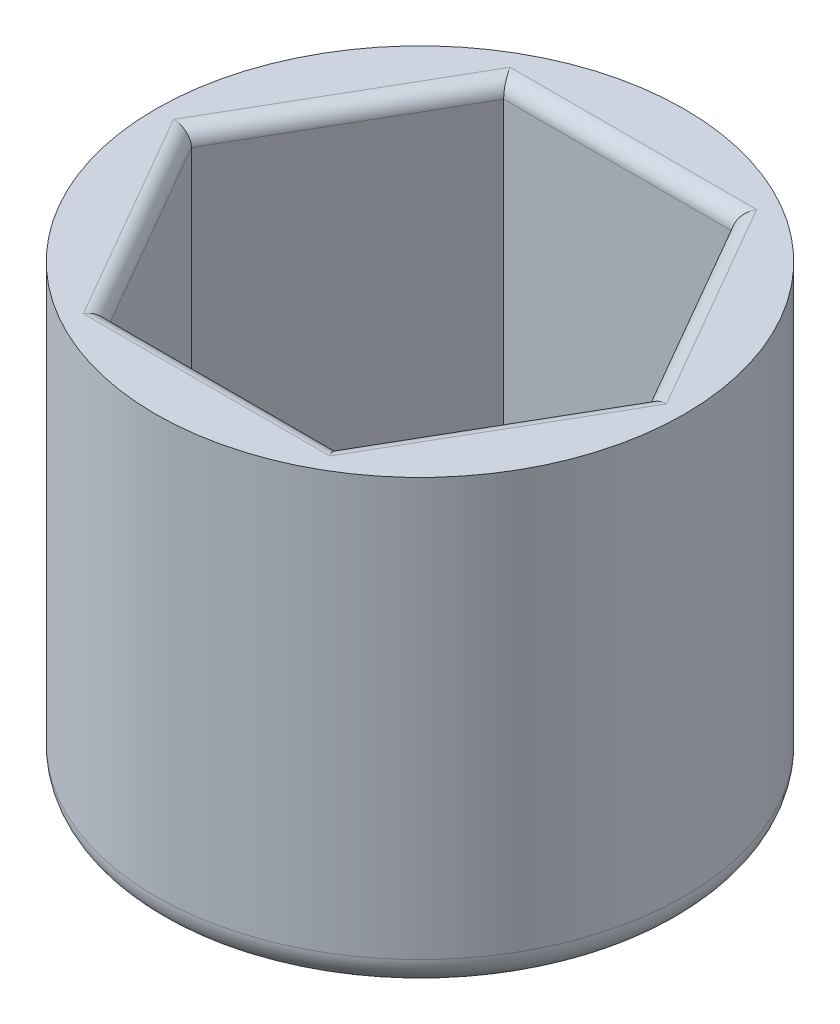
ISO-10303-21;
HEADER;
FILE_DESCRIPTION(('STEP AP214'),'2;1');
FILE_NAME('part.step','',(''),(''),'','','');
FILE_SCHEMA(('AUTOMOTIVE_DESIGN { 1 0 10303 214 1 1 1 1 }'));
ENDSEC;
DATA;
#1=APPLICATION_CONTEXT('core data for automotive mechanical design processes');
#2=APPLICATION_PROTOCOL_DEFINITION('international standard','automotive_design',2000,#1);
#3=PRODUCT_CONTEXT('',#1,'mechanical');
#4=PRODUCT('Part','Part','',(#3));
#5=PRODUCT_RELATED_PRODUCT_CATEGORY('part','',(#4));
#6=PRODUCT_DEFINITION_FORMATION('','',#4);
#7=PRODUCT_DEFINITION_CONTEXT('part definition',#1,'design');
#8=PRODUCT_DEFINITION('design','',#6,#7);
#9=PRODUCT_DEFINITION_SHAPE('','',#8);
#10=(LENGTH_UNIT() NAMED_UNIT(*) SI_UNIT(.MILLI.,.METRE.));
#11=(NAMED_UNIT(*) PLANE_ANGLE_UNIT() SI_UNIT($,.RADIAN.));
#12=(NAMED_UNIT(*) SI_UNIT($,.STERADIAN.) SOLID_ANGLE_UNIT());
#13=UNCERTAINTY_MEASURE_WITH_UNIT(LENGTH_MEASURE(1.E-05),#10,'distance_accuracy_value','');
#14=(GEOMETRIC_REPRESENTATION_CONTEXT(3) GLOBAL_UNCERTAINTY_ASSIGNED_CONTEXT((#13)) GLOBAL_UNIT_ASSIGNED_CONTEXT((#10,
#11,#12)) REPRESENTATION_CONTEXT('',''));
#15=CARTESIAN_POINT('',(0.,0.,0.));
#16=DIRECTION('',(0.,0.,1.));
#17=DIRECTION('',(1.,0.,0.));
#18=AXIS2_PLACEMENT_3D('',#15,#16,#17);
#19=CARTESIAN_POINT('',(0.,12.,0.));
#20=DIRECTION('',(0.,1.,0.));
#21=DIRECTION('',(0.,0.,1.));
#22=AXIS2_PLACEMENT_3D('',#19,#20,#21);
#23=PLANE('',#22);
#24=DIRECTION('',(0.5,0.,-0.866025403784439));
#25=VECTOR('',#24,1.);
#26=CARTESIAN_POINT('',(5.97557528611263,12.,3.45));
#27=LINE('',#26,#25);
#28=CARTESIAN_POINT('',(7.96743371481684,12.,0.));
#29=VERTEX_POINT('',#28);
#30=CARTESIAN_POINT('',(3.98371685740842,12.,6.9));
#31=VERTEX_POINT('',#30);
#32=EDGE_CURVE('E160',#29,#31,#27,.F.);
#33=ORIENTED_EDGE('',*,*,#32,.T.);
#34=DIRECTION('',(1.,0.,0.));
#35=VECTOR('',#34,1.);
#36=CARTESIAN_POINT('',(0.,12.,6.9));
#37=LINE('',#36,#35);
#38=CARTESIAN_POINT('',(-3.98371685740841,12.,6.9));
#39=VERTEX_POINT('',#38);
#40=EDGE_CURVE('E170',#31,#39,#37,.F.);
#41=ORIENTED_EDGE('',*,*,#40,.T.);
#42=DIRECTION('',(0.5,0.,0.866025403784438));
#43=VECTOR('',#42,1.);
#44=CARTESIAN_POINT('',(-5.97557528611263,12.,3.45));
#45=LINE('',#44,#43);
#46=CARTESIAN_POINT('',(-7.96743371481684,12.,0.));
#47=VERTEX_POINT('',#46);
#48=EDGE_CURVE('E168',#39,#47,#45,.F.);
#49=ORIENTED_EDGE('',*,*,#48,.T.);
#50=DIRECTION('',(-0.5,0.,0.866025403784439));
#51=VECTOR('',#50,1.);
#52=CARTESIAN_POINT('',(-5.97557528611263,12.,-3.45));
#53=LINE('',#52,#51);
#54=CARTESIAN_POINT('',(-3.98371685740842,12.,-6.9));
#55=VERTEX_POINT('',#54);
#56=EDGE_CURVE('E166',#47,#55,#53,.F.);
#57=ORIENTED_EDGE('',*,*,#56,.T.);
#58=DIRECTION('',(-1.,0.,0.));
#59=VECTOR('',#58,1.);
#60=CARTESIAN_POINT('',(0.,12.,-6.9));
#61=LINE('',#60,#59);
#62=CARTESIAN_POINT('',(3.98371685740842,12.,-6.9));
#63=VERTEX_POINT('',#62);
#64=EDGE_CURVE('E164',#55,#63,#61,.F.);
#65=ORIENTED_EDGE('',*,*,#64,.T.);
#66=DIRECTION('',(-0.5,0.,-0.866025403784439));
#67=VECTOR('',#66,1.);
#68=CARTESIAN_POINT('',(5.97557528611263,12.,-3.45));
#69=LINE('',#68,#67);
#70=EDGE_CURVE('E162',#63,#29,#69,.F.);
#71=ORIENTED_EDGE('',*,*,#70,.T.);
#72=EDGE_LOOP('',(#33,#41,#49,#57,#65,#71));
#73=FACE_BOUND('',#72,.T.);
#74=CARTESIAN_POINT('',(0.,12.,0.));
#75=DIRECTION('',(0.,1.,0.));
#76=DIRECTION('',(0.,0.,1.));
#77=AXIS2_PLACEMENT_3D('',#74,#75,#76);
#78=CIRCLE('',#77,8.54478398400646);
#79=CARTESIAN_POINT('',(0.,12.,-8.54478398400646));
#80=VERTEX_POINT('',#79);
#81=EDGE_CURVE('E184',#80,#80,#78,.F.);
#82=ORIENTED_EDGE('',*,*,#81,.F.);
#83=EDGE_LOOP('',(#82));
#84=FACE_BOUND('',#83,.T.);
#85=ADVANCED_FACE('F49',(#73,#84),#23,.T.);
#86=CARTESIAN_POINT('',(3.69504172281361,12.,-6.4));
#87=DIRECTION('',(0.,0.,1.));
#88=DIRECTION('',(1.,0.,0.));
#89=AXIS2_PLACEMENT_3D('',#86,#87,#88);
#90=PLANE('',#89);
#91=DIRECTION('',(0.,-1.,0.));
#92=VECTOR('',#91,1.);
#93=CARTESIAN_POINT('',(3.69504172281361,12.,-6.4));
#94=LINE('',#93,#92);
#95=CARTESIAN_POINT('',(3.69504172281361,11.5,-6.4));
#96=VERTEX_POINT('',#95);
#97=CARTESIAN_POINT('',(3.69504172281361,0.,-6.4));
#98=VERTEX_POINT('',#97);
#99=EDGE_CURVE('E119',#96,#98,#94,.T.);
#100=ORIENTED_EDGE('',*,*,#99,.F.);
#101=DIRECTION('',(-1.,0.,0.));
#102=VECTOR('',#101,1.);
#103=CARTESIAN_POINT('',(3.69504172281361,11.5,-6.4));
#104=LINE('',#103,#102);
#105=CARTESIAN_POINT('',(-3.6950417228136,11.5,-6.4));
#106=VERTEX_POINT('',#105);
#107=EDGE_CURVE('E177',#96,#106,#104,.T.);
#108=ORIENTED_EDGE('',*,*,#107,.T.);
#109=DIRECTION('',(0.,-1.,0.));
#110=VECTOR('',#109,1.);
#111=CARTESIAN_POINT('',(-3.6950417228136,12.,-6.4));
#112=LINE('',#111,#110);
#113=CARTESIAN_POINT('',(-3.6950417228136,0.,-6.4));
#114=VERTEX_POINT('',#113);
#115=EDGE_CURVE('E133',#106,#114,#112,.T.);
#116=ORIENTED_EDGE('',*,*,#115,.T.);
#117=DIRECTION('',(-1.,0.,0.));
#118=VECTOR('',#117,1.);
#119=CARTESIAN_POINT('',(3.69504172281361,0.,-6.4));
#120=LINE('',#119,#118);
#121=EDGE_CURVE('E130',#98,#114,#120,.T.);
#122=ORIENTED_EDGE('',*,*,#121,.F.);
#123=EDGE_LOOP('',(#100,#108,#116,#122));
#124=FACE_BOUND('',#123,.T.);
#125=ADVANCED_FACE('F131',(#124),#90,.T.);
#126=CARTESIAN_POINT('',(-3.6950417228136,12.,-6.4));
#127=DIRECTION('',(0.866025403784439,0.,0.5));
#128=DIRECTION('',(0.5,0.,-0.866025403784439));
#129=AXIS2_PLACEMENT_3D('',#126,#127,#128);
#130=PLANE('',#129);
#131=ORIENTED_EDGE('',*,*,#115,.F.);
#132=DIRECTION('',(-0.5,0.,0.866025403784439));
#133=VECTOR('',#132,1.);
#134=CARTESIAN_POINT('',(-3.6950417228136,11.5,-6.4));
#135=LINE('',#134,#133);
#136=CARTESIAN_POINT('',(-7.39008344562721,11.5,0.));
#137=VERTEX_POINT('',#136);
#138=EDGE_CURVE('E175',#106,#137,#135,.T.);
#139=ORIENTED_EDGE('',*,*,#138,.T.);
#140=DIRECTION('',(0.,-1.,0.));
#141=VECTOR('',#140,1.);
#142=CARTESIAN_POINT('',(-7.39008344562721,12.,0.));
#143=LINE('',#142,#141);
#144=CARTESIAN_POINT('',(-7.39008344562721,0.,0.));
#145=VERTEX_POINT('',#144);
#146=EDGE_CURVE('E154',#137,#145,#143,.T.);
#147=ORIENTED_EDGE('',*,*,#146,.T.);
#148=DIRECTION('',(-0.5,0.,0.866025403784438));
#149=VECTOR('',#148,1.);
#150=CARTESIAN_POINT('',(-3.6950417228136,0.,-6.4));
#151=LINE('',#150,#149);
#152=EDGE_CURVE('E137',#114,#145,#151,.T.);
#153=ORIENTED_EDGE('',*,*,#152,.F.);
#154=EDGE_LOOP('',(#131,#139,#147,#153));
#155=FACE_BOUND('',#154,.T.);
#156=ADVANCED_FACE('F217',(#155),#130,.T.);
#157=CARTESIAN_POINT('',(-7.39008344562721,12.,0.));
#158=DIRECTION('',(0.866025403784438,0.,-0.5));
#159=DIRECTION('',(-0.5,0.,-0.866025403784438));
#160=AXIS2_PLACEMENT_3D('',#157,#158,#159);
#161=PLANE('',#160);
#162=ORIENTED_EDGE('',*,*,#146,.F.);
#163=DIRECTION('',(0.5,0.,0.866025403784438));
#164=VECTOR('',#163,1.);
#165=CARTESIAN_POINT('',(-7.39008344562721,11.5,0.));
#166=LINE('',#165,#164);
#167=CARTESIAN_POINT('',(-3.6950417228136,11.5,6.4));
#168=VERTEX_POINT('',#167);
#169=EDGE_CURVE('E173',#137,#168,#166,.T.);
#170=ORIENTED_EDGE('',*,*,#169,.T.);
#171=DIRECTION('',(0.,-1.,0.));
#172=VECTOR('',#171,1.);
#173=CARTESIAN_POINT('',(-3.6950417228136,12.,6.4));
#174=LINE('',#173,#172);
#175=CARTESIAN_POINT('',(-3.6950417228136,0.,6.4));
#176=VERTEX_POINT('',#175);
#177=EDGE_CURVE('E152',#168,#176,#174,.T.);
#178=ORIENTED_EDGE('',*,*,#177,.T.);
#179=DIRECTION('',(0.5,0.,0.866025403784438));
#180=VECTOR('',#179,1.);
#181=CARTESIAN_POINT('',(-7.39008344562721,0.,0.));
#182=LINE('',#181,#180);
#183=EDGE_CURVE('E270',#145,#176,#182,.T.);
#184=ORIENTED_EDGE('',*,*,#183,.F.);
#185=EDGE_LOOP('',(#162,#170,#178,#184));
#186=FACE_BOUND('',#185,.T.);
#187=ADVANCED_FACE('F264',(#186),#161,.T.);
#188=CARTESIAN_POINT('',(-3.6950417228136,12.,6.4));
#189=DIRECTION('',(0.,0.,-1.));
#190=DIRECTION('',(-1.,0.,0.));
#191=AXIS2_PLACEMENT_3D('',#188,#189,#190);
#192=PLANE('',#191);
#193=ORIENTED_EDGE('',*,*,#177,.F.);
#194=DIRECTION('',(1.,0.,0.));
#195=VECTOR('',#194,1.);
#196=CARTESIAN_POINT('',(-3.6950417228136,11.5,6.4));
#197=LINE('',#196,#195);
#198=CARTESIAN_POINT('',(3.69504172281361,11.5,6.4));
#199=VERTEX_POINT('',#198);
#200=EDGE_CURVE('E157',#168,#199,#197,.T.);
#201=ORIENTED_EDGE('',*,*,#200,.T.);
#202=DIRECTION('',(0.,-1.,0.));
#203=VECTOR('',#202,1.);
#204=CARTESIAN_POINT('',(3.69504172281361,12.,6.4));
#205=LINE('',#204,#203);
#206=CARTESIAN_POINT('',(3.69504172281361,0.,6.4));
#207=VERTEX_POINT('',#206);
#208=EDGE_CURVE('E150',#199,#207,#205,.T.);
#209=ORIENTED_EDGE('',*,*,#208,.T.);
#210=DIRECTION('',(1.,0.,0.));
#211=VECTOR('',#210,1.);
#212=CARTESIAN_POINT('',(-3.6950417228136,0.,6.4));
#213=LINE('',#212,#211);
#214=EDGE_CURVE('E145',#176,#207,#213,.T.);
#215=ORIENTED_EDGE('',*,*,#214,.F.);
#216=EDGE_LOOP('',(#193,#201,#209,#215));
#217=FACE_BOUND('',#216,.T.);
#218=ADVANCED_FACE('F268',(#217),#192,.T.);
#219=CARTESIAN_POINT('',(3.69504172281361,12.,6.4));
#220=DIRECTION('',(-0.866025403784438,0.,-0.5));
#221=DIRECTION('',(-0.5,0.,0.866025403784439));
#222=AXIS2_PLACEMENT_3D('',#219,#220,#221);
#223=PLANE('',#222);
#224=ORIENTED_EDGE('',*,*,#208,.F.);
#225=DIRECTION('',(0.5,0.,-0.866025403784439));
#226=VECTOR('',#225,1.);
#227=CARTESIAN_POINT('',(3.69504172281361,11.5,6.4));
#228=LINE('',#227,#226);
#229=CARTESIAN_POINT('',(7.39008344562721,11.5,0.));
#230=VERTEX_POINT('',#229);
#231=EDGE_CURVE('E64',#199,#230,#228,.T.);
#232=ORIENTED_EDGE('',*,*,#231,.T.);
#233=DIRECTION('',(0.,-1.,0.));
#234=VECTOR('',#233,1.);
#235=CARTESIAN_POINT('',(7.39008344562721,12.,0.));
#236=LINE('',#235,#234);
#237=CARTESIAN_POINT('',(7.39008344562721,0.,0.));
#238=VERTEX_POINT('',#237);
#239=EDGE_CURVE('E127',#230,#238,#236,.T.);
#240=ORIENTED_EDGE('',*,*,#239,.T.);
#241=DIRECTION('',(0.5,0.,-0.866025403784439));
#242=VECTOR('',#241,1.);
#243=CARTESIAN_POINT('',(3.69504172281361,0.,6.4));
#244=LINE('',#243,#242);
#245=EDGE_CURVE('E143',#207,#238,#244,.T.);
#246=ORIENTED_EDGE('',*,*,#245,.F.);
#247=EDGE_LOOP('',(#224,#232,#240,#246));
#248=FACE_BOUND('',#247,.T.);
#249=ADVANCED_FACE('F286',(#248),#223,.T.);
#250=CARTESIAN_POINT('',(7.39008344562721,12.,0.));
#251=DIRECTION('',(-0.866025403784438,0.,0.5));
#252=DIRECTION('',(0.5,0.,0.866025403784439));
#253=AXIS2_PLACEMENT_3D('',#250,#251,#252);
#254=PLANE('',#253);
#255=ORIENTED_EDGE('',*,*,#239,.F.);
#256=DIRECTION('',(-0.5,0.,-0.866025403784439));
#257=VECTOR('',#256,1.);
#258=CARTESIAN_POINT('',(7.39008344562721,11.5,0.));
#259=LINE('',#258,#257);
#260=EDGE_CURVE('E71',#230,#96,#259,.T.);
#261=ORIENTED_EDGE('',*,*,#260,.T.);
#262=ORIENTED_EDGE('',*,*,#99,.T.);
#263=DIRECTION('',(-0.5,0.,-0.866025403784439));
#264=VECTOR('',#263,1.);
#265=CARTESIAN_POINT('',(7.39008344562721,0.,0.));
#266=LINE('',#265,#264);
#267=EDGE_CURVE('E123',#238,#98,#266,.T.);
#268=ORIENTED_EDGE('',*,*,#267,.F.);
#269=EDGE_LOOP('',(#255,#261,#262,#268));
#270=FACE_BOUND('',#269,.T.);
#271=ADVANCED_FACE('F121',(#270),#254,.T.);
#272=CARTESIAN_POINT('',(0.,0.,0.));
#273=DIRECTION('',(0.,-1.,0.));
#274=DIRECTION('',(0.,0.,-1.));
#275=AXIS2_PLACEMENT_3D('',#272,#273,#274);
#276=PLANE('',#275);
#277=ORIENTED_EDGE('',*,*,#267,.T.);
#278=ORIENTED_EDGE('',*,*,#121,.T.);
#279=ORIENTED_EDGE('',*,*,#152,.T.);
#280=ORIENTED_EDGE('',*,*,#183,.T.);
#281=ORIENTED_EDGE('',*,*,#214,.T.);
#282=ORIENTED_EDGE('',*,*,#245,.T.);
#283=EDGE_LOOP('',(#277,#278,#279,#280,#281,#282));
#284=FACE_BOUND('',#283,.T.);
#285=ADVANCED_FACE('F140',(#284),#276,.F.);
#286=CARTESIAN_POINT('',(0.,-2.5,0.));
#287=DIRECTION('',(0.,-1.,0.));
#288=DIRECTION('',(0.,0.,-1.));
#289=AXIS2_PLACEMENT_3D('',#286,#287,#288);
#290=PLANE('',#289);
#291=CARTESIAN_POINT('',(0.,-2.5,0.));
#292=DIRECTION('',(0.,-1.,0.));
#293=DIRECTION('',(0.,0.,-1.));
#294=AXIS2_PLACEMENT_3D('',#291,#292,#293);
#295=CIRCLE('',#294,7.54478398400646);
#296=CARTESIAN_POINT('',(0.,-2.5,-7.54478398400646));
#297=VERTEX_POINT('',#296);
#298=EDGE_CURVE('E57',#297,#297,#295,.T.);
#299=ORIENTED_EDGE('',*,*,#298,.T.);
#300=EDGE_LOOP('',(#299));
#301=FACE_BOUND('',#300,.T.);
#302=ADVANCED_FACE('F199',(#301),#290,.T.);
#303=CARTESIAN_POINT('',(3.69504172281361,11.5,-6.9));
#304=DIRECTION('',(-1.,0.,0.));
#305=DIRECTION('',(0.,0.,1.));
#306=AXIS2_PLACEMENT_3D('',#303,#304,#305);
#307=CYLINDRICAL_SURFACE('',#306,0.5);
#308=CARTESIAN_POINT('',(3.98371685740842,11.5,-6.9));
#309=DIRECTION('',(-0.866025403784439,0.,-0.5));
#310=DIRECTION('',(-0.5,0.,0.866025403784439));
#311=AXIS2_PLACEMENT_3D('',#308,#309,#310);
#312=ELLIPSE('',#311,0.577350269189626,0.5);
#313=EDGE_CURVE('E192',#63,#96,#312,.F.);
#314=ORIENTED_EDGE('',*,*,#313,.F.);
#315=ORIENTED_EDGE('',*,*,#64,.F.);
#316=CARTESIAN_POINT('',(-3.98371685740842,11.5,-6.9));
#317=DIRECTION('',(-0.866025403784439,0.,0.5));
#318=DIRECTION('',(0.5,0.,0.866025403784439));
#319=AXIS2_PLACEMENT_3D('',#316,#317,#318);
#320=ELLIPSE('',#319,0.577350269189626,0.5);
#321=EDGE_CURVE('E138',#106,#55,#320,.T.);
#322=ORIENTED_EDGE('',*,*,#321,.F.);
#323=ORIENTED_EDGE('',*,*,#107,.F.);
#324=EDGE_LOOP('',(#314,#315,#322,#323));
#325=FACE_BOUND('',#324,.T.);
#326=ADVANCED_FACE('F239',(#325),#307,.T.);
#327=CARTESIAN_POINT('',(-4.12805442470582,11.5,-6.65));
#328=DIRECTION('',(-0.5,0.,0.866025403784439));
#329=DIRECTION('',(0.866025403784439,0.,0.5));
#330=AXIS2_PLACEMENT_3D('',#327,#328,#329);
#331=CYLINDRICAL_SURFACE('',#330,0.5);
#332=ORIENTED_EDGE('',*,*,#321,.T.);
#333=ORIENTED_EDGE('',*,*,#56,.F.);
#334=CARTESIAN_POINT('',(-7.96743371481684,11.5,0.));
#335=DIRECTION('',(0.,0.,1.));
#336=DIRECTION('',(1.,0.,0.));
#337=AXIS2_PLACEMENT_3D('',#334,#335,#336);
#338=ELLIPSE('',#337,0.577350269189626,0.5);
#339=EDGE_CURVE('E189',#137,#47,#338,.T.);
#340=ORIENTED_EDGE('',*,*,#339,.F.);
#341=ORIENTED_EDGE('',*,*,#138,.F.);
#342=EDGE_LOOP('',(#332,#333,#340,#341));
#343=FACE_BOUND('',#342,.T.);
#344=ADVANCED_FACE('F236',(#343),#331,.T.);
#345=CARTESIAN_POINT('',(7.82309614751943,11.5,-0.249999999999998));
#346=DIRECTION('',(-0.5,0.,-0.866025403784439));
#347=DIRECTION('',(-0.866025403784439,0.,0.5));
#348=AXIS2_PLACEMENT_3D('',#345,#346,#347);
#349=CYLINDRICAL_SURFACE('',#348,0.5);
#350=ORIENTED_EDGE('',*,*,#313,.T.);
#351=ORIENTED_EDGE('',*,*,#260,.F.);
#352=CARTESIAN_POINT('',(7.96743371481684,11.5,0.));
#353=DIRECTION('',(0.,0.,-1.));
#354=DIRECTION('',(-1.,0.,0.));
#355=AXIS2_PLACEMENT_3D('',#352,#353,#354);
#356=ELLIPSE('',#355,0.577350269189626,0.5);
#357=EDGE_CURVE('E186',#29,#230,#356,.F.);
#358=ORIENTED_EDGE('',*,*,#357,.F.);
#359=ORIENTED_EDGE('',*,*,#70,.F.);
#360=EDGE_LOOP('',(#350,#351,#358,#359));
#361=FACE_BOUND('',#360,.T.);
#362=ADVANCED_FACE('F232',(#361),#349,.T.);
#363=CARTESIAN_POINT('',(-7.82309614751943,11.5,0.249999999999999));
#364=DIRECTION('',(0.5,0.,0.866025403784438));
#365=DIRECTION('',(0.866025403784438,0.,-0.5));
#366=AXIS2_PLACEMENT_3D('',#363,#364,#365);
#367=CYLINDRICAL_SURFACE('',#366,0.5);
#368=ORIENTED_EDGE('',*,*,#339,.T.);
#369=ORIENTED_EDGE('',*,*,#48,.F.);
#370=CARTESIAN_POINT('',(-3.98371685740841,11.5,6.90000000000001));
#371=DIRECTION('',(0.866025403784439,0.,0.5));
#372=DIRECTION('',(0.5,0.,-0.866025403784439));
#373=AXIS2_PLACEMENT_3D('',#370,#371,#372);
#374=ELLIPSE('',#373,0.577350269189626,0.5);
#375=EDGE_CURVE('E183',#168,#39,#374,.T.);
#376=ORIENTED_EDGE('',*,*,#375,.F.);
#377=ORIENTED_EDGE('',*,*,#169,.F.);
#378=EDGE_LOOP('',(#368,#369,#376,#377));
#379=FACE_BOUND('',#378,.T.);
#380=ADVANCED_FACE('F228',(#379),#367,.T.);
#381=CARTESIAN_POINT('',(4.12805442470583,11.5,6.65));
#382=DIRECTION('',(0.5,0.,-0.866025403784439));
#383=DIRECTION('',(-0.866025403784439,0.,-0.5));
#384=AXIS2_PLACEMENT_3D('',#381,#382,#383);
#385=CYLINDRICAL_SURFACE('',#384,0.5);
#386=ORIENTED_EDGE('',*,*,#357,.T.);
#387=ORIENTED_EDGE('',*,*,#231,.F.);
#388=CARTESIAN_POINT('',(3.98371685740842,11.5,6.9));
#389=DIRECTION('',(0.866025403784439,0.,-0.5));
#390=DIRECTION('',(0.5,0.,0.866025403784439));
#391=AXIS2_PLACEMENT_3D('',#388,#389,#390);
#392=ELLIPSE('',#391,0.577350269189626,0.5);
#393=EDGE_CURVE('E181',#31,#199,#392,.F.);
#394=ORIENTED_EDGE('',*,*,#393,.F.);
#395=ORIENTED_EDGE('',*,*,#32,.F.);
#396=EDGE_LOOP('',(#386,#387,#394,#395));
#397=FACE_BOUND('',#396,.T.);
#398=ADVANCED_FACE('F224',(#397),#385,.T.);
#399=CARTESIAN_POINT('',(-3.6950417228136,11.5,6.9));
#400=DIRECTION('',(1.,0.,0.));
#401=DIRECTION('',(0.,0.,-1.));
#402=AXIS2_PLACEMENT_3D('',#399,#400,#401);
#403=CYLINDRICAL_SURFACE('',#402,0.5);
#404=ORIENTED_EDGE('',*,*,#375,.T.);
#405=ORIENTED_EDGE('',*,*,#40,.F.);
#406=ORIENTED_EDGE('',*,*,#393,.T.);
#407=ORIENTED_EDGE('',*,*,#200,.F.);
#408=EDGE_LOOP('',(#404,#405,#406,#407));
#409=FACE_BOUND('',#408,.T.);
#410=ADVANCED_FACE('F207',(#409),#403,.T.);
#411=CARTESIAN_POINT('',(0.,20.6211289111909,0.));
#412=DIRECTION('',(0.,-1.,0.));
#413=DIRECTION('',(0.,0.,-1.));
#414=AXIS2_PLACEMENT_3D('',#411,#412,#413);
#415=CYLINDRICAL_SURFACE('',#414,8.54478398400646);
#416=CARTESIAN_POINT('',(0.,-1.5,0.));
#417=DIRECTION('',(0.,-1.,0.));
#418=DIRECTION('',(0.,0.,-1.));
#419=AXIS2_PLACEMENT_3D('',#416,#417,#418);
#420=CIRCLE('',#419,8.54478398400646);
#421=CARTESIAN_POINT('',(0.,-1.5,-8.54478398400646));
#422=VERTEX_POINT('',#421);
#423=EDGE_CURVE('E12',#422,#422,#420,.F.);
#424=CARTESIAN_POINT('',(0.,-1.5,-8.54478398400646));
#425=CARTESIAN_POINT('',(0.,-1.359375,-8.54478398400646));
#426=CARTESIAN_POINT('',(0.,-1.21875,-8.54478398400646));
#427=CARTESIAN_POINT('',(0.,-0.937500000000002,-8.54478398400646));
#428=CARTESIAN_POINT('',(0.,-0.796875000000001,-8.54478398400646));
#429=CARTESIAN_POINT('',(0.,-0.515625000000001,-8.54478398400646));
#430=CARTESIAN_POINT('',(0.,-0.375000000000001,-8.54478398400646));
#431=CARTESIAN_POINT('',(0.,-0.0937500000000013,-8.54478398400646));
#432=CARTESIAN_POINT('',(0.,0.0468749999999995,-8.54478398400646));
#433=CARTESIAN_POINT('',(0.,0.328125,-8.54478398400646));
#434=CARTESIAN_POINT('',(0.,0.468749999999999,-8.54478398400646));
#435=CARTESIAN_POINT('',(0.,0.749999999999998,-8.54478398400646));
#436=CARTESIAN_POINT('',(0.,0.890624999999998,-8.54478398400646));
#437=CARTESIAN_POINT('',(0.,1.171875,-8.54478398400646));
#438=CARTESIAN_POINT('',(0.,1.3125,-8.54478398400646));
#439=CARTESIAN_POINT('',(0.,1.59375,-8.54478398400646));
#440=CARTESIAN_POINT('',(0.,1.734375,-8.54478398400646));
#441=CARTESIAN_POINT('',(0.,2.015625,-8.54478398400646));
#442=CARTESIAN_POINT('',(0.,2.15625,-8.54478398400646));
#443=CARTESIAN_POINT('',(0.,2.4375,-8.54478398400646));
#444=CARTESIAN_POINT('',(0.,2.578125,-8.54478398400646));
#445=CARTESIAN_POINT('',(0.,2.859375,-8.54478398400646));
#446=CARTESIAN_POINT('',(0.,3.,-8.54478398400646));
#447=CARTESIAN_POINT('',(0.,3.28125,-8.54478398400646));
#448=CARTESIAN_POINT('',(0.,3.421875,-8.54478398400646));
#449=CARTESIAN_POINT('',(0.,3.703125,-8.54478398400646));
#450=CARTESIAN_POINT('',(0.,3.84375,-8.54478398400646));
#451=CARTESIAN_POINT('',(0.,4.125,-8.54478398400646));
#452=CARTESIAN_POINT('',(0.,4.265625,-8.54478398400646));
#453=CARTESIAN_POINT('',(0.,4.546875,-8.54478398400646));
#454=CARTESIAN_POINT('',(0.,4.6875,-8.54478398400646));
#455=CARTESIAN_POINT('',(0.,4.96875,-8.54478398400646));
#456=CARTESIAN_POINT('',(0.,5.109375,-8.54478398400646));
#457=CARTESIAN_POINT('',(0.,5.390625,-8.54478398400646));
#458=CARTESIAN_POINT('',(0.,5.53125,-8.54478398400646));
#459=CARTESIAN_POINT('',(0.,5.8125,-8.54478398400646));
#460=CARTESIAN_POINT('',(0.,5.953125,-8.54478398400646));
#461=CARTESIAN_POINT('',(0.,6.234375,-8.54478398400646));
#462=CARTESIAN_POINT('',(0.,6.375,-8.54478398400646));
#463=CARTESIAN_POINT('',(0.,6.65625,-8.54478398400646));
#464=CARTESIAN_POINT('',(0.,6.796875,-8.54478398400646));
#465=CARTESIAN_POINT('',(0.,7.078125,-8.54478398400646));
#466=CARTESIAN_POINT('',(0.,7.21875,-8.54478398400646));
#467=CARTESIAN_POINT('',(0.,7.5,-8.54478398400646));
#468=CARTESIAN_POINT('',(0.,7.640625,-8.54478398400646));
#469=CARTESIAN_POINT('',(0.,7.921875,-8.54478398400646));
#470=CARTESIAN_POINT('',(0.,8.0625,-8.54478398400646));
#471=CARTESIAN_POINT('',(0.,8.34375,-8.54478398400646));
#472=CARTESIAN_POINT('',(0.,8.484375,-8.54478398400646));
#473=CARTESIAN_POINT('',(0.,8.765625,-8.54478398400646));
#474=CARTESIAN_POINT('',(0.,8.90625,-8.54478398400646));
#475=CARTESIAN_POINT('',(0.,9.1875,-8.54478398400646));
#476=CARTESIAN_POINT('',(0.,9.328125,-8.54478398400646));
#477=CARTESIAN_POINT('',(0.,9.609375,-8.54478398400646));
#478=CARTESIAN_POINT('',(0.,9.75,-8.54478398400646));
#479=CARTESIAN_POINT('',(0.,10.03125,-8.54478398400646));
#480=CARTESIAN_POINT('',(0.,10.171875,-8.54478398400646));
#481=CARTESIAN_POINT('',(0.,10.453125,-8.54478398400646));
#482=CARTESIAN_POINT('',(0.,10.59375,-8.54478398400646));
#483=CARTESIAN_POINT('',(0.,10.875,-8.54478398400646));
#484=CARTESIAN_POINT('',(0.,11.015625,-8.54478398400646));
#485=CARTESIAN_POINT('',(0.,11.296875,-8.54478398400646));
#486=CARTESIAN_POINT('',(0.,11.4375,-8.54478398400646));
#487=CARTESIAN_POINT('',(0.,11.71875,-8.54478398400646));
#488=CARTESIAN_POINT('',(0.,11.859375,-8.54478398400646));
#489=CARTESIAN_POINT('',(0.,12.,-8.54478398400646));
#490=B_SPLINE_CURVE_WITH_KNOTS('',3,(#424,#425,#426,#427,#428,#429,#430,#431,#432,#433,#434,
#435,#436,#437,#438,#439,#440,#441,#442,#443,#444,#445,#446,#447,#448,#449,#450,#451,#452,#453,
#454,#455,#456,#457,#458,#459,#460,#461,#462,#463,#464,#465,#466,#467,#468,#469,#470,#471,#472,
#473,#474,#475,#476,#477,#478,#479,#480,#481,#482,#483,#484,#485,#486,#487,#488,#489),
.UNSPECIFIED.,.F.,.F.,(4,2,2,2,2,2,2,2,2,2,2,2,2,2,2,2,2,2,2,2,2,2,2,2,2,2,2,2,2,2,2,2,4),(0.,
0.421874999999999,0.843750000000001,1.265625,1.6875,2.109375,2.53125,2.953125,3.375,3.796875,
4.21875,4.640625,5.0625,5.484375,5.90625,6.328125,6.75,7.171875,7.59375,8.015625,8.4375,
8.859375,9.28125,9.703125,10.125,10.546875,10.96875,11.390625,11.8125,12.234375,12.65625,
13.078125,13.5),.UNSPECIFIED.);
#491=EDGE_CURVE('BSEAM202',#422,#80,#490,.T.);
#492=ORIENTED_EDGE('',*,*,#423,.T.);
#493=ORIENTED_EDGE('',*,*,#81,.T.);
#494=ORIENTED_EDGE('',*,*,#491,.T.);
#495=ORIENTED_EDGE('',*,*,#491,.F.);
#496=EDGE_LOOP('',(#492,#494,#493,#495));
#497=FACE_BOUND('',#496,.T.);
#498=ADVANCED_FACE('F202',(#497),#415,.T.);
#499=CARTESIAN_POINT('',(0.,-1.5,0.));
#500=DIRECTION('',(0.,-1.,0.));
#501=DIRECTION('',(0.,0.,-1.));
#502=AXIS2_PLACEMENT_3D('',#499,#500,#501);
#503=TOROIDAL_SURFACE('',#502,7.54478398400646,1.);
#504=ORIENTED_EDGE('',*,*,#423,.F.);
#505=EDGE_LOOP('',(#504));
#506=FACE_BOUND('',#505,.T.);
#507=ORIENTED_EDGE('',*,*,#298,.F.);
#508=EDGE_LOOP('',(#507));
#509=FACE_BOUND('',#508,.T.);
#510=ADVANCED_FACE('F51',(#506,#509),#503,.T.);
#511=CLOSED_SHELL('',(#85,#125,#156,#187,#218,#249,#271,#285,#302,#326,#344,#362,#380,#398,#410,
#498,#510));
#512=MANIFOLD_SOLID_BREP('B2',#511);
#513=ADVANCED_BREP_SHAPE_REPRESENTATION('',(#18,#512),#14);
#514=SHAPE_DEFINITION_REPRESENTATION(#9,#513);
ENDSEC;
END-ISO-10303-21;
